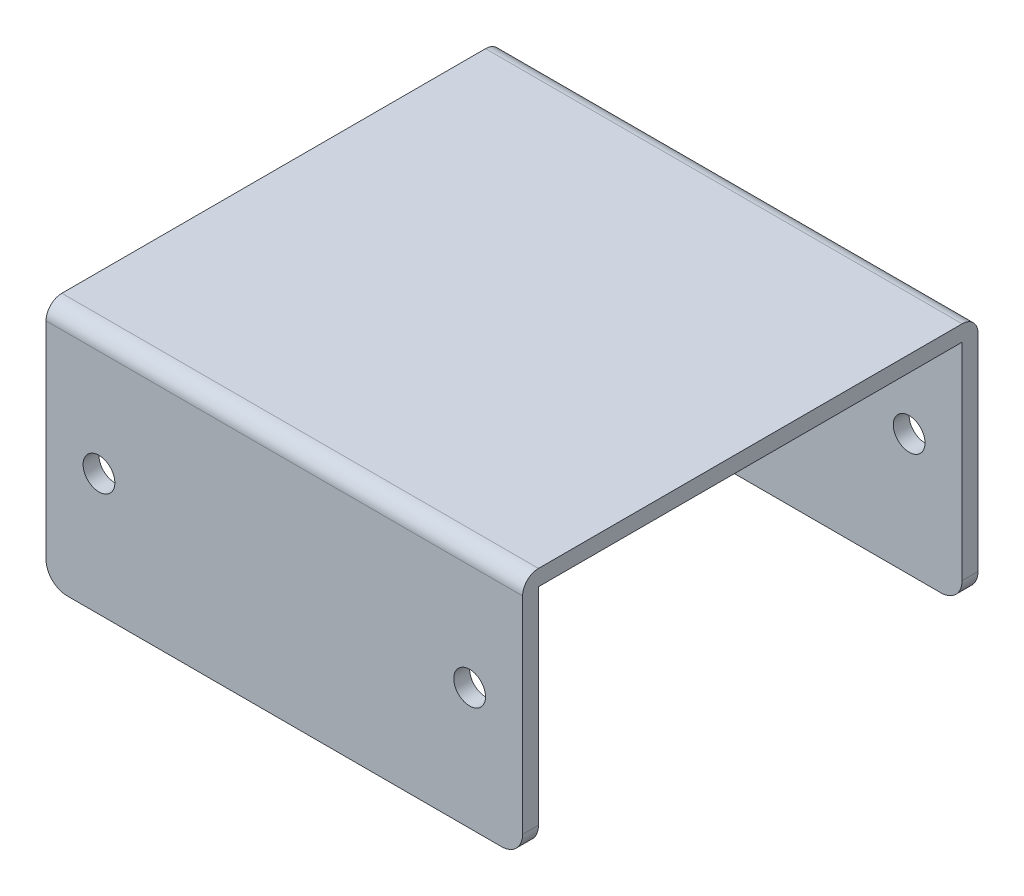
ISO-10303-21;
HEADER;
FILE_DESCRIPTION(('STEP AP214'),'2;1');
FILE_NAME('part.step','',(''),(''),'','','');
FILE_SCHEMA(('AUTOMOTIVE_DESIGN { 1 0 10303 214 1 1 1 1 }'));
ENDSEC;
DATA;
#1=APPLICATION_CONTEXT('core data for automotive mechanical design processes');
#2=APPLICATION_PROTOCOL_DEFINITION('international standard','automotive_design',2000,#1);
#3=PRODUCT_CONTEXT('',#1,'mechanical');
#4=PRODUCT('Part','Part','',(#3));
#5=PRODUCT_RELATED_PRODUCT_CATEGORY('part','',(#4));
#6=PRODUCT_DEFINITION_FORMATION('','',#4);
#7=PRODUCT_DEFINITION_CONTEXT('part definition',#1,'design');
#8=PRODUCT_DEFINITION('design','',#6,#7);
#9=PRODUCT_DEFINITION_SHAPE('','',#8);
#10=(LENGTH_UNIT() NAMED_UNIT(*) SI_UNIT(.MILLI.,.METRE.));
#11=(NAMED_UNIT(*) PLANE_ANGLE_UNIT() SI_UNIT($,.RADIAN.));
#12=(NAMED_UNIT(*) SI_UNIT($,.STERADIAN.) SOLID_ANGLE_UNIT());
#13=UNCERTAINTY_MEASURE_WITH_UNIT(LENGTH_MEASURE(1.E-05),#10,'distance_accuracy_value','');
#14=(GEOMETRIC_REPRESENTATION_CONTEXT(3) GLOBAL_UNCERTAINTY_ASSIGNED_CONTEXT((#13)) GLOBAL_UNIT_ASSIGNED_CONTEXT((#10,
#11,#12)) REPRESENTATION_CONTEXT('',''));
#15=CARTESIAN_POINT('',(0.,0.,0.));
#16=DIRECTION('',(0.,0.,1.));
#17=DIRECTION('',(1.,0.,0.));
#18=AXIS2_PLACEMENT_3D('',#15,#16,#17);
#19=CARTESIAN_POINT('',(0.,0.,0.));
#20=DIRECTION('',(0.,1.,0.));
#21=DIRECTION('',(0.,0.,1.));
#22=AXIS2_PLACEMENT_3D('',#19,#20,#21);
#23=PLANE('',#22);
#24=DIRECTION('',(-1.,0.,0.));
#25=VECTOR('',#24,1.);
#26=CARTESIAN_POINT('',(22.5,0.,-21.5));
#27=LINE('',#26,#25);
#28=CARTESIAN_POINT('',(20.5,0.,-21.5));
#29=VERTEX_POINT('',#28);
#30=CARTESIAN_POINT('',(-20.5,0.,-21.5));
#31=VERTEX_POINT('',#30);
#32=EDGE_CURVE('E187',#29,#31,#27,.T.);
#33=ORIENTED_EDGE('',*,*,#32,.F.);
#34=DIRECTION('',(0.,0.,-1.));
#35=VECTOR('',#34,1.);
#36=CARTESIAN_POINT('',(20.5,0.,0.));
#37=LINE('',#36,#35);
#38=CARTESIAN_POINT('',(20.5,0.,-20.));
#39=VERTEX_POINT('',#38);
#40=EDGE_CURVE('E243',#29,#39,#37,.F.);
#41=ORIENTED_EDGE('',*,*,#40,.T.);
#42=DIRECTION('',(-1.,0.,0.));
#43=VECTOR('',#42,1.);
#44=CARTESIAN_POINT('',(22.5,0.,-20.));
#45=LINE('',#44,#43);
#46=CARTESIAN_POINT('',(-20.5,0.,-20.));
#47=VERTEX_POINT('',#46);
#48=EDGE_CURVE('E169',#39,#47,#45,.T.);
#49=ORIENTED_EDGE('',*,*,#48,.T.);
#50=DIRECTION('',(0.,0.,1.));
#51=VECTOR('',#50,1.);
#52=CARTESIAN_POINT('',(-20.5,0.,0.));
#53=LINE('',#52,#51);
#54=EDGE_CURVE('E241',#47,#31,#53,.F.);
#55=ORIENTED_EDGE('',*,*,#54,.T.);
#56=EDGE_LOOP('',(#33,#41,#49,#55));
#57=FACE_BOUND('',#56,.T.);
#58=ADVANCED_FACE('F38',(#57),#23,.F.);
#59=CARTESIAN_POINT('',(-22.5,23.,21.5));
#60=DIRECTION('',(1.,0.,0.));
#61=DIRECTION('',(0.,0.,-1.));
#62=AXIS2_PLACEMENT_3D('',#59,#60,#61);
#63=PLANE('',#62);
#64=DIRECTION('',(0.,-1.,0.));
#65=VECTOR('',#64,1.);
#66=CARTESIAN_POINT('',(-22.5,23.,-21.5));
#67=LINE('',#66,#65);
#68=CARTESIAN_POINT('',(-22.5,21.5,-21.5));
#69=VERTEX_POINT('',#68);
#70=CARTESIAN_POINT('',(-22.5,2.,-21.5));
#71=VERTEX_POINT('',#70);
#72=EDGE_CURVE('E190',#69,#71,#67,.T.);
#73=ORIENTED_EDGE('',*,*,#72,.T.);
#74=DIRECTION('',(0.,0.,1.));
#75=VECTOR('',#74,1.);
#76=CARTESIAN_POINT('',(-22.5,2.,21.5));
#77=LINE('',#76,#75);
#78=CARTESIAN_POINT('',(-22.5,2.,-20.));
#79=VERTEX_POINT('',#78);
#80=EDGE_CURVE('E11',#71,#79,#77,.T.);
#81=ORIENTED_EDGE('',*,*,#80,.T.);
#82=DIRECTION('',(0.,-1.,0.));
#83=VECTOR('',#82,1.);
#84=CARTESIAN_POINT('',(-22.5,23.,-20.));
#85=LINE('',#84,#83);
#86=CARTESIAN_POINT('',(-22.5,21.5,-20.));
#87=VERTEX_POINT('',#86);
#88=EDGE_CURVE('E168',#87,#79,#85,.T.);
#89=ORIENTED_EDGE('',*,*,#88,.F.);
#90=DIRECTION('',(0.,0.,1.));
#91=VECTOR('',#90,1.);
#92=CARTESIAN_POINT('',(-22.5,21.5,21.5));
#93=LINE('',#92,#91);
#94=CARTESIAN_POINT('',(-22.5,21.5,20.));
#95=VERTEX_POINT('',#94);
#96=EDGE_CURVE('E147',#87,#95,#93,.T.);
#97=ORIENTED_EDGE('',*,*,#96,.T.);
#98=DIRECTION('',(0.,-1.,0.));
#99=VECTOR('',#98,1.);
#100=CARTESIAN_POINT('',(-22.5,23.,20.));
#101=LINE('',#100,#99);
#102=CARTESIAN_POINT('',(-22.5,2.,20.));
#103=VERTEX_POINT('',#102);
#104=EDGE_CURVE('E156',#95,#103,#101,.T.);
#105=ORIENTED_EDGE('',*,*,#104,.T.);
#106=DIRECTION('',(0.,0.,1.));
#107=VECTOR('',#106,1.);
#108=CARTESIAN_POINT('',(-22.5,2.,21.5));
#109=LINE('',#108,#107);
#110=CARTESIAN_POINT('',(-22.5,2.,21.5));
#111=VERTEX_POINT('',#110);
#112=EDGE_CURVE('E46',#103,#111,#109,.T.);
#113=ORIENTED_EDGE('',*,*,#112,.T.);
#114=DIRECTION('',(0.,-1.,0.));
#115=VECTOR('',#114,1.);
#116=CARTESIAN_POINT('',(-22.5,23.,21.5));
#117=LINE('',#116,#115);
#118=CARTESIAN_POINT('',(-22.5,21.5,21.5));
#119=VERTEX_POINT('',#118);
#120=EDGE_CURVE('E201',#119,#111,#117,.T.);
#121=ORIENTED_EDGE('',*,*,#120,.F.);
#122=CARTESIAN_POINT('',(-22.5,21.5,20.));
#123=DIRECTION('',(1.,0.,0.));
#124=DIRECTION('',(0.,0.,-1.));
#125=AXIS2_PLACEMENT_3D('',#122,#123,#124);
#126=CIRCLE('',#125,1.5);
#127=CARTESIAN_POINT('',(-22.5,23.,20.));
#128=VERTEX_POINT('',#127);
#129=EDGE_CURVE('E219',#119,#128,#126,.F.);
#130=ORIENTED_EDGE('',*,*,#129,.T.);
#131=DIRECTION('',(0.,0.,1.));
#132=VECTOR('',#131,1.);
#133=CARTESIAN_POINT('',(-22.5,23.,21.5));
#134=LINE('',#133,#132);
#135=CARTESIAN_POINT('',(-22.5,23.,-20.));
#136=VERTEX_POINT('',#135);
#137=EDGE_CURVE('E183',#136,#128,#134,.T.);
#138=ORIENTED_EDGE('',*,*,#137,.F.);
#139=CARTESIAN_POINT('',(-22.5,21.5,-20.));
#140=DIRECTION('',(1.,0.,0.));
#141=DIRECTION('',(0.,0.,-1.));
#142=AXIS2_PLACEMENT_3D('',#139,#140,#141);
#143=CIRCLE('',#142,1.5);
#144=EDGE_CURVE('E221',#136,#69,#143,.F.);
#145=ORIENTED_EDGE('',*,*,#144,.T.);
#146=EDGE_LOOP('',(#73,#81,#89,#97,#105,#113,#121,#130,#138,#145));
#147=FACE_BOUND('',#146,.T.);
#148=ADVANCED_FACE('F166',(#147),#63,.F.);
#149=CARTESIAN_POINT('',(22.5,23.,21.5));
#150=DIRECTION('',(0.,0.,-1.));
#151=DIRECTION('',(-1.,0.,0.));
#152=AXIS2_PLACEMENT_3D('',#149,#150,#151);
#153=PLANE('',#152);
#154=CARTESIAN_POINT('',(-17.5,11.5,21.5));
#155=DIRECTION('',(0.,0.,1.));
#156=DIRECTION('',(1.,0.,0.));
#157=AXIS2_PLACEMENT_3D('',#154,#155,#156);
#158=CIRCLE('',#157,1.5);
#159=CARTESIAN_POINT('',(-16.,11.5,21.5));
#160=VERTEX_POINT('',#159);
#161=EDGE_CURVE('E302',#160,#160,#158,.T.);
#162=ORIENTED_EDGE('',*,*,#161,.F.);
#163=EDGE_LOOP('',(#162));
#164=FACE_BOUND('',#163,.T.);
#165=CARTESIAN_POINT('',(17.5,11.5,21.5));
#166=DIRECTION('',(0.,0.,1.));
#167=DIRECTION('',(1.,0.,0.));
#168=AXIS2_PLACEMENT_3D('',#165,#166,#167);
#169=CIRCLE('',#168,1.5);
#170=CARTESIAN_POINT('',(19.,11.5,21.5));
#171=VERTEX_POINT('',#170);
#172=EDGE_CURVE('E296',#171,#171,#169,.T.);
#173=ORIENTED_EDGE('',*,*,#172,.F.);
#174=EDGE_LOOP('',(#173));
#175=FACE_BOUND('',#174,.T.);
#176=DIRECTION('',(1.,0.,0.));
#177=VECTOR('',#176,1.);
#178=CARTESIAN_POINT('',(22.5,0.,21.5));
#179=LINE('',#178,#177);
#180=CARTESIAN_POINT('',(-20.5,0.,21.5));
#181=VERTEX_POINT('',#180);
#182=CARTESIAN_POINT('',(20.5,0.,21.5));
#183=VERTEX_POINT('',#182);
#184=EDGE_CURVE('E162',#181,#183,#179,.T.);
#185=ORIENTED_EDGE('',*,*,#184,.T.);
#186=CARTESIAN_POINT('',(20.5,2.,21.5));
#187=DIRECTION('',(0.,0.,-1.));
#188=DIRECTION('',(-1.,0.,0.));
#189=AXIS2_PLACEMENT_3D('',#186,#187,#188);
#190=CIRCLE('',#189,2.);
#191=CARTESIAN_POINT('',(22.5,2.,21.5));
#192=VERTEX_POINT('',#191);
#193=EDGE_CURVE('E256',#183,#192,#190,.F.);
#194=ORIENTED_EDGE('',*,*,#193,.T.);
#195=DIRECTION('',(0.,-1.,0.));
#196=VECTOR('',#195,1.);
#197=CARTESIAN_POINT('',(22.5,23.,21.5));
#198=LINE('',#197,#196);
#199=CARTESIAN_POINT('',(22.5,21.5,21.5));
#200=VERTEX_POINT('',#199);
#201=EDGE_CURVE('E198',#200,#192,#198,.T.);
#202=ORIENTED_EDGE('',*,*,#201,.F.);
#203=DIRECTION('',(1.,0.,0.));
#204=VECTOR('',#203,1.);
#205=CARTESIAN_POINT('',(-22.5,21.5,21.5));
#206=LINE('',#205,#204);
#207=EDGE_CURVE('E229',#200,#119,#206,.F.);
#208=ORIENTED_EDGE('',*,*,#207,.T.);
#209=ORIENTED_EDGE('',*,*,#120,.T.);
#210=CARTESIAN_POINT('',(-20.5,2.,21.5));
#211=DIRECTION('',(0.,0.,-1.));
#212=DIRECTION('',(-1.,0.,0.));
#213=AXIS2_PLACEMENT_3D('',#210,#211,#212);
#214=CIRCLE('',#213,2.);
#215=EDGE_CURVE('E53',#111,#181,#214,.F.);
#216=ORIENTED_EDGE('',*,*,#215,.T.);
#217=EDGE_LOOP('',(#185,#194,#202,#208,#209,#216));
#218=FACE_BOUND('',#217,.T.);
#219=ADVANCED_FACE('F260',(#164,#175,#218),#153,.F.);
#220=CARTESIAN_POINT('',(22.5,23.,21.5));
#221=DIRECTION('',(-1.,0.,0.));
#222=DIRECTION('',(0.,0.,1.));
#223=AXIS2_PLACEMENT_3D('',#220,#221,#222);
#224=PLANE('',#223);
#225=DIRECTION('',(0.,-1.,0.));
#226=VECTOR('',#225,1.);
#227=CARTESIAN_POINT('',(22.5,23.,-20.));
#228=LINE('',#227,#226);
#229=CARTESIAN_POINT('',(22.5,21.5,-20.));
#230=VERTEX_POINT('',#229);
#231=CARTESIAN_POINT('',(22.5,2.,-20.));
#232=VERTEX_POINT('',#231);
#233=EDGE_CURVE('E176',#230,#232,#228,.T.);
#234=ORIENTED_EDGE('',*,*,#233,.T.);
#235=DIRECTION('',(0.,0.,-1.));
#236=VECTOR('',#235,1.);
#237=CARTESIAN_POINT('',(22.5,2.,21.5));
#238=LINE('',#237,#236);
#239=CARTESIAN_POINT('',(22.5,2.,-21.5));
#240=VERTEX_POINT('',#239);
#241=EDGE_CURVE('E234',#232,#240,#238,.T.);
#242=ORIENTED_EDGE('',*,*,#241,.T.);
#243=DIRECTION('',(0.,-1.,0.));
#244=VECTOR('',#243,1.);
#245=CARTESIAN_POINT('',(22.5,23.,-21.5));
#246=LINE('',#245,#244);
#247=CARTESIAN_POINT('',(22.5,21.5,-21.5));
#248=VERTEX_POINT('',#247);
#249=EDGE_CURVE('E195',#248,#240,#246,.T.);
#250=ORIENTED_EDGE('',*,*,#249,.F.);
#251=CARTESIAN_POINT('',(22.5,21.5,-20.));
#252=DIRECTION('',(-1.,0.,0.));
#253=DIRECTION('',(0.,0.,1.));
#254=AXIS2_PLACEMENT_3D('',#251,#252,#253);
#255=CIRCLE('',#254,1.5);
#256=CARTESIAN_POINT('',(22.5,23.,-20.));
#257=VERTEX_POINT('',#256);
#258=EDGE_CURVE('E227',#248,#257,#255,.F.);
#259=ORIENTED_EDGE('',*,*,#258,.T.);
#260=DIRECTION('',(0.,0.,-1.));
#261=VECTOR('',#260,1.);
#262=CARTESIAN_POINT('',(22.5,23.,21.5));
#263=LINE('',#262,#261);
#264=CARTESIAN_POINT('',(22.5,23.,20.));
#265=VERTEX_POINT('',#264);
#266=EDGE_CURVE('E186',#265,#257,#263,.T.);
#267=ORIENTED_EDGE('',*,*,#266,.F.);
#268=CARTESIAN_POINT('',(22.5,21.5,20.));
#269=DIRECTION('',(-1.,0.,0.));
#270=DIRECTION('',(0.,0.,1.));
#271=AXIS2_PLACEMENT_3D('',#268,#269,#270);
#272=CIRCLE('',#271,1.5);
#273=EDGE_CURVE('E225',#265,#200,#272,.F.);
#274=ORIENTED_EDGE('',*,*,#273,.T.);
#275=ORIENTED_EDGE('',*,*,#201,.T.);
#276=DIRECTION('',(0.,0.,-1.));
#277=VECTOR('',#276,1.);
#278=CARTESIAN_POINT('',(22.5,2.,21.5));
#279=LINE('',#278,#277);
#280=CARTESIAN_POINT('',(22.5,2.,20.));
#281=VERTEX_POINT('',#280);
#282=EDGE_CURVE('E231',#192,#281,#279,.T.);
#283=ORIENTED_EDGE('',*,*,#282,.T.);
#284=DIRECTION('',(0.,-1.,0.));
#285=VECTOR('',#284,1.);
#286=CARTESIAN_POINT('',(22.5,23.,20.));
#287=LINE('',#286,#285);
#288=CARTESIAN_POINT('',(22.5,21.5,20.));
#289=VERTEX_POINT('',#288);
#290=EDGE_CURVE('E163',#289,#281,#287,.T.);
#291=ORIENTED_EDGE('',*,*,#290,.F.);
#292=DIRECTION('',(0.,0.,-1.));
#293=VECTOR('',#292,1.);
#294=CARTESIAN_POINT('',(22.5,21.5,21.5));
#295=LINE('',#294,#293);
#296=EDGE_CURVE('E150',#289,#230,#295,.T.);
#297=ORIENTED_EDGE('',*,*,#296,.T.);
#298=EDGE_LOOP('',(#234,#242,#250,#259,#267,#274,#275,#283,#291,#297));
#299=FACE_BOUND('',#298,.T.);
#300=ADVANCED_FACE('F348',(#299),#224,.F.);
#301=CARTESIAN_POINT('',(22.5,23.,-21.5));
#302=DIRECTION('',(0.,0.,1.));
#303=DIRECTION('',(1.,0.,0.));
#304=AXIS2_PLACEMENT_3D('',#301,#302,#303);
#305=PLANE('',#304);
#306=CARTESIAN_POINT('',(-17.5,11.5,-21.5));
#307=DIRECTION('',(0.,0.,1.));
#308=DIRECTION('',(1.,0.,0.));
#309=AXIS2_PLACEMENT_3D('',#306,#307,#308);
#310=CIRCLE('',#309,1.5);
#311=CARTESIAN_POINT('',(-16.,11.5,-21.5));
#312=VERTEX_POINT('',#311);
#313=EDGE_CURVE('E209',#312,#312,#310,.T.);
#314=ORIENTED_EDGE('',*,*,#313,.T.);
#315=EDGE_LOOP('',(#314));
#316=FACE_BOUND('',#315,.T.);
#317=CARTESIAN_POINT('',(17.5,11.5,-21.5));
#318=DIRECTION('',(0.,0.,1.));
#319=DIRECTION('',(1.,0.,0.));
#320=AXIS2_PLACEMENT_3D('',#317,#318,#319);
#321=CIRCLE('',#320,1.5);
#322=CARTESIAN_POINT('',(19.,11.5,-21.5));
#323=VERTEX_POINT('',#322);
#324=EDGE_CURVE('E299',#323,#323,#321,.T.);
#325=ORIENTED_EDGE('',*,*,#324,.T.);
#326=EDGE_LOOP('',(#325));
#327=FACE_BOUND('',#326,.T.);
#328=ORIENTED_EDGE('',*,*,#249,.T.);
#329=CARTESIAN_POINT('',(20.5,2.,-21.5));
#330=DIRECTION('',(0.,0.,1.));
#331=DIRECTION('',(1.,0.,0.));
#332=AXIS2_PLACEMENT_3D('',#329,#330,#331);
#333=CIRCLE('',#332,2.);
#334=EDGE_CURVE('E239',#240,#29,#333,.F.);
#335=ORIENTED_EDGE('',*,*,#334,.T.);
#336=ORIENTED_EDGE('',*,*,#32,.T.);
#337=CARTESIAN_POINT('',(-20.5,2.,-21.5));
#338=DIRECTION('',(0.,0.,1.));
#339=DIRECTION('',(1.,0.,0.));
#340=AXIS2_PLACEMENT_3D('',#337,#338,#339);
#341=CIRCLE('',#340,2.);
#342=EDGE_CURVE('E237',#31,#71,#341,.F.);
#343=ORIENTED_EDGE('',*,*,#342,.T.);
#344=ORIENTED_EDGE('',*,*,#72,.F.);
#345=DIRECTION('',(-1.,0.,0.));
#346=VECTOR('',#345,1.);
#347=CARTESIAN_POINT('',(22.5,21.5,-21.5));
#348=LINE('',#347,#346);
#349=EDGE_CURVE('E223',#69,#248,#348,.F.);
#350=ORIENTED_EDGE('',*,*,#349,.T.);
#351=EDGE_LOOP('',(#328,#335,#336,#343,#344,#350));
#352=FACE_BOUND('',#351,.T.);
#353=ADVANCED_FACE('F278',(#316,#327,#352),#305,.F.);
#354=CARTESIAN_POINT('',(0.,23.,0.));
#355=DIRECTION('',(0.,1.,0.));
#356=DIRECTION('',(0.,0.,1.));
#357=AXIS2_PLACEMENT_3D('',#354,#355,#356);
#358=PLANE('',#357);
#359=ORIENTED_EDGE('',*,*,#266,.T.);
#360=DIRECTION('',(-1.,0.,0.));
#361=VECTOR('',#360,1.);
#362=CARTESIAN_POINT('',(-22.5,23.,-20.));
#363=LINE('',#362,#361);
#364=EDGE_CURVE('E216',#257,#136,#363,.T.);
#365=ORIENTED_EDGE('',*,*,#364,.T.);
#366=ORIENTED_EDGE('',*,*,#137,.T.);
#367=DIRECTION('',(1.,0.,0.));
#368=VECTOR('',#367,1.);
#369=CARTESIAN_POINT('',(22.5,23.,20.));
#370=LINE('',#369,#368);
#371=EDGE_CURVE('E204',#128,#265,#370,.T.);
#372=ORIENTED_EDGE('',*,*,#371,.T.);
#373=EDGE_LOOP('',(#359,#365,#366,#372));
#374=FACE_BOUND('',#373,.T.);
#375=ADVANCED_FACE('F268',(#374),#358,.T.);
#376=DIRECTION('',(1.,0.,0.));
#377=VECTOR('',#376,1.);
#378=CARTESIAN_POINT('',(22.5,0.,20.));
#379=LINE('',#378,#377);
#380=CARTESIAN_POINT('',(-20.5,0.,20.));
#381=VERTEX_POINT('',#380);
#382=CARTESIAN_POINT('',(20.5,0.,20.));
#383=VERTEX_POINT('',#382);
#384=EDGE_CURVE('E172',#381,#383,#379,.T.);
#385=ORIENTED_EDGE('',*,*,#384,.T.);
#386=DIRECTION('',(0.,0.,-1.));
#387=VECTOR('',#386,1.);
#388=CARTESIAN_POINT('',(20.5,0.,0.));
#389=LINE('',#388,#387);
#390=EDGE_CURVE('E61',#383,#183,#389,.F.);
#391=ORIENTED_EDGE('',*,*,#390,.T.);
#392=ORIENTED_EDGE('',*,*,#184,.F.);
#393=DIRECTION('',(0.,0.,1.));
#394=VECTOR('',#393,1.);
#395=CARTESIAN_POINT('',(-20.5,0.,0.));
#396=LINE('',#395,#394);
#397=EDGE_CURVE('E252',#181,#381,#396,.F.);
#398=ORIENTED_EDGE('',*,*,#397,.T.);
#399=EDGE_LOOP('',(#385,#391,#392,#398));
#400=FACE_BOUND('',#399,.T.);
#401=ADVANCED_FACE('F328',(#400),#23,.F.);
#402=CARTESIAN_POINT('',(22.5,23.,20.));
#403=DIRECTION('',(0.,0.,-1.));
#404=DIRECTION('',(-1.,0.,0.));
#405=AXIS2_PLACEMENT_3D('',#402,#403,#404);
#406=PLANE('',#405);
#407=CARTESIAN_POINT('',(-17.5,11.5,20.));
#408=DIRECTION('',(0.,0.,-1.));
#409=DIRECTION('',(-1.,0.,0.));
#410=AXIS2_PLACEMENT_3D('',#407,#408,#409);
#411=CIRCLE('',#410,1.5);
#412=CARTESIAN_POINT('',(-19.,11.5,20.));
#413=VERTEX_POINT('',#412);
#414=EDGE_CURVE('E213',#413,#413,#411,.T.);
#415=ORIENTED_EDGE('',*,*,#414,.F.);
#416=EDGE_LOOP('',(#415));
#417=FACE_BOUND('',#416,.T.);
#418=CARTESIAN_POINT('',(17.5,11.5,20.));
#419=DIRECTION('',(0.,0.,-1.));
#420=DIRECTION('',(-1.,0.,0.));
#421=AXIS2_PLACEMENT_3D('',#418,#419,#420);
#422=CIRCLE('',#421,1.5);
#423=CARTESIAN_POINT('',(16.,11.5,20.));
#424=VERTEX_POINT('',#423);
#425=EDGE_CURVE('E208',#424,#424,#422,.T.);
#426=ORIENTED_EDGE('',*,*,#425,.F.);
#427=EDGE_LOOP('',(#426));
#428=FACE_BOUND('',#427,.T.);
#429=ORIENTED_EDGE('',*,*,#290,.T.);
#430=CARTESIAN_POINT('',(20.5,2.,20.));
#431=DIRECTION('',(0.,0.,-1.));
#432=DIRECTION('',(-1.,0.,0.));
#433=AXIS2_PLACEMENT_3D('',#430,#431,#432);
#434=CIRCLE('',#433,2.);
#435=EDGE_CURVE('E250',#281,#383,#434,.T.);
#436=ORIENTED_EDGE('',*,*,#435,.T.);
#437=ORIENTED_EDGE('',*,*,#384,.F.);
#438=CARTESIAN_POINT('',(-20.5,2.,20.));
#439=DIRECTION('',(0.,0.,-1.));
#440=DIRECTION('',(-1.,0.,0.));
#441=AXIS2_PLACEMENT_3D('',#438,#439,#440);
#442=CIRCLE('',#441,2.);
#443=EDGE_CURVE('E160',#381,#103,#442,.T.);
#444=ORIENTED_EDGE('',*,*,#443,.T.);
#445=ORIENTED_EDGE('',*,*,#104,.F.);
#446=DIRECTION('',(1.,0.,0.));
#447=VECTOR('',#446,1.);
#448=CARTESIAN_POINT('',(22.5,21.5,20.));
#449=LINE('',#448,#447);
#450=EDGE_CURVE('E142',#95,#289,#449,.T.);
#451=ORIENTED_EDGE('',*,*,#450,.T.);
#452=EDGE_LOOP('',(#429,#436,#437,#444,#445,#451));
#453=FACE_BOUND('',#452,.T.);
#454=ADVANCED_FACE('F157',(#417,#428,#453),#406,.T.);
#455=CARTESIAN_POINT('',(22.5,23.,-20.));
#456=DIRECTION('',(0.,0.,1.));
#457=DIRECTION('',(1.,0.,0.));
#458=AXIS2_PLACEMENT_3D('',#455,#456,#457);
#459=PLANE('',#458);
#460=CARTESIAN_POINT('',(-17.5,11.5,-20.));
#461=DIRECTION('',(0.,0.,1.));
#462=DIRECTION('',(1.,0.,0.));
#463=AXIS2_PLACEMENT_3D('',#460,#461,#462);
#464=CIRCLE('',#463,1.5);
#465=CARTESIAN_POINT('',(-16.,11.5,-20.));
#466=VERTEX_POINT('',#465);
#467=EDGE_CURVE('E210',#466,#466,#464,.T.);
#468=ORIENTED_EDGE('',*,*,#467,.F.);
#469=EDGE_LOOP('',(#468));
#470=FACE_BOUND('',#469,.T.);
#471=CARTESIAN_POINT('',(17.5,11.5,-20.));
#472=DIRECTION('',(0.,0.,1.));
#473=DIRECTION('',(1.,0.,0.));
#474=AXIS2_PLACEMENT_3D('',#471,#472,#473);
#475=CIRCLE('',#474,1.5);
#476=CARTESIAN_POINT('',(19.,11.5,-20.));
#477=VERTEX_POINT('',#476);
#478=EDGE_CURVE('E205',#477,#477,#475,.T.);
#479=ORIENTED_EDGE('',*,*,#478,.F.);
#480=EDGE_LOOP('',(#479));
#481=FACE_BOUND('',#480,.T.);
#482=ORIENTED_EDGE('',*,*,#48,.F.);
#483=CARTESIAN_POINT('',(20.5,2.,-20.));
#484=DIRECTION('',(0.,0.,1.));
#485=DIRECTION('',(1.,0.,0.));
#486=AXIS2_PLACEMENT_3D('',#483,#484,#485);
#487=CIRCLE('',#486,2.);
#488=EDGE_CURVE('E247',#39,#232,#487,.T.);
#489=ORIENTED_EDGE('',*,*,#488,.T.);
#490=ORIENTED_EDGE('',*,*,#233,.F.);
#491=DIRECTION('',(-1.,0.,0.));
#492=VECTOR('',#491,1.);
#493=CARTESIAN_POINT('',(22.5,21.5,-20.));
#494=LINE('',#493,#492);
#495=EDGE_CURVE('E177',#230,#87,#494,.T.);
#496=ORIENTED_EDGE('',*,*,#495,.T.);
#497=ORIENTED_EDGE('',*,*,#88,.T.);
#498=CARTESIAN_POINT('',(-20.5,2.,-20.));
#499=DIRECTION('',(0.,0.,1.));
#500=DIRECTION('',(1.,0.,0.));
#501=AXIS2_PLACEMENT_3D('',#498,#499,#500);
#502=CIRCLE('',#501,2.);
#503=EDGE_CURVE('E245',#79,#47,#502,.T.);
#504=ORIENTED_EDGE('',*,*,#503,.T.);
#505=EDGE_LOOP('',(#482,#489,#490,#496,#497,#504));
#506=FACE_BOUND('',#505,.T.);
#507=ADVANCED_FACE('F287',(#470,#481,#506),#459,.T.);
#508=CARTESIAN_POINT('',(0.,21.5,0.));
#509=DIRECTION('',(0.,1.,0.));
#510=DIRECTION('',(0.,0.,1.));
#511=AXIS2_PLACEMENT_3D('',#508,#509,#510);
#512=PLANE('',#511);
#513=ORIENTED_EDGE('',*,*,#96,.F.);
#514=ORIENTED_EDGE('',*,*,#495,.F.);
#515=ORIENTED_EDGE('',*,*,#296,.F.);
#516=ORIENTED_EDGE('',*,*,#450,.F.);
#517=EDGE_LOOP('',(#513,#514,#515,#516));
#518=FACE_BOUND('',#517,.T.);
#519=ADVANCED_FACE('F144',(#518),#512,.F.);
#520=CARTESIAN_POINT('',(17.5,11.5,-21.5));
#521=DIRECTION('',(0.,0.,1.));
#522=DIRECTION('',(1.,0.,0.));
#523=AXIS2_PLACEMENT_3D('',#520,#521,#522);
#524=CYLINDRICAL_SURFACE('',#523,1.5);
#525=ORIENTED_EDGE('',*,*,#478,.T.);
#526=EDGE_LOOP('',(#525));
#527=FACE_BOUND('',#526,.T.);
#528=ORIENTED_EDGE('',*,*,#324,.F.);
#529=EDGE_LOOP('',(#528));
#530=FACE_BOUND('',#529,.T.);
#531=ADVANCED_FACE('F313',(#527,#530),#524,.F.);
#532=CARTESIAN_POINT('',(-17.5,11.5,-21.5));
#533=DIRECTION('',(0.,0.,1.));
#534=DIRECTION('',(1.,0.,0.));
#535=AXIS2_PLACEMENT_3D('',#532,#533,#534);
#536=CYLINDRICAL_SURFACE('',#535,1.5);
#537=ORIENTED_EDGE('',*,*,#467,.T.);
#538=EDGE_LOOP('',(#537));
#539=FACE_BOUND('',#538,.T.);
#540=ORIENTED_EDGE('',*,*,#313,.F.);
#541=EDGE_LOOP('',(#540));
#542=FACE_BOUND('',#541,.T.);
#543=ADVANCED_FACE('F310',(#539,#542),#536,.F.);
#544=ORIENTED_EDGE('',*,*,#425,.T.);
#545=EDGE_LOOP('',(#544));
#546=FACE_BOUND('',#545,.T.);
#547=ORIENTED_EDGE('',*,*,#172,.T.);
#548=EDGE_LOOP('',(#547));
#549=FACE_BOUND('',#548,.T.);
#550=ADVANCED_FACE('F312',(#546,#549),#524,.F.);
#551=ORIENTED_EDGE('',*,*,#414,.T.);
#552=EDGE_LOOP('',(#551));
#553=FACE_BOUND('',#552,.T.);
#554=ORIENTED_EDGE('',*,*,#161,.T.);
#555=EDGE_LOOP('',(#554));
#556=FACE_BOUND('',#555,.T.);
#557=ADVANCED_FACE('F316',(#553,#556),#536,.F.);
#558=CARTESIAN_POINT('',(0.,21.5,-20.));
#559=DIRECTION('',(1.,0.,0.));
#560=DIRECTION('',(0.,0.,-1.));
#561=AXIS2_PLACEMENT_3D('',#558,#559,#560);
#562=CYLINDRICAL_SURFACE('',#561,1.5);
#563=ORIENTED_EDGE('',*,*,#258,.F.);
#564=ORIENTED_EDGE('',*,*,#349,.F.);
#565=ORIENTED_EDGE('',*,*,#144,.F.);
#566=ORIENTED_EDGE('',*,*,#364,.F.);
#567=EDGE_LOOP('',(#563,#564,#565,#566));
#568=FACE_BOUND('',#567,.T.);
#569=ADVANCED_FACE('F273',(#568),#562,.T.);
#570=CARTESIAN_POINT('',(0.,21.5,20.));
#571=DIRECTION('',(-1.,0.,0.));
#572=DIRECTION('',(0.,0.,1.));
#573=AXIS2_PLACEMENT_3D('',#570,#571,#572);
#574=CYLINDRICAL_SURFACE('',#573,1.5);
#575=ORIENTED_EDGE('',*,*,#129,.F.);
#576=ORIENTED_EDGE('',*,*,#207,.F.);
#577=ORIENTED_EDGE('',*,*,#273,.F.);
#578=ORIENTED_EDGE('',*,*,#371,.F.);
#579=EDGE_LOOP('',(#575,#576,#577,#578));
#580=FACE_BOUND('',#579,.T.);
#581=ADVANCED_FACE('F264',(#580),#574,.T.);
#582=CARTESIAN_POINT('',(20.5,2.,21.5));
#583=DIRECTION('',(0.,0.,-1.));
#584=DIRECTION('',(-1.,0.,0.));
#585=AXIS2_PLACEMENT_3D('',#582,#583,#584);
#586=CYLINDRICAL_SURFACE('',#585,2.);
#587=ORIENTED_EDGE('',*,*,#488,.F.);
#588=ORIENTED_EDGE('',*,*,#40,.F.);
#589=ORIENTED_EDGE('',*,*,#334,.F.);
#590=ORIENTED_EDGE('',*,*,#241,.F.);
#591=EDGE_LOOP('',(#587,#588,#589,#590));
#592=FACE_BOUND('',#591,.T.);
#593=ADVANCED_FACE('F366',(#592),#586,.T.);
#594=CARTESIAN_POINT('',(20.5,2.,21.5));
#595=DIRECTION('',(0.,0.,-1.));
#596=DIRECTION('',(-1.,0.,0.));
#597=AXIS2_PLACEMENT_3D('',#594,#595,#596);
#598=CYLINDRICAL_SURFACE('',#597,2.);
#599=ORIENTED_EDGE('',*,*,#193,.F.);
#600=ORIENTED_EDGE('',*,*,#390,.F.);
#601=ORIENTED_EDGE('',*,*,#435,.F.);
#602=ORIENTED_EDGE('',*,*,#282,.F.);
#603=EDGE_LOOP('',(#599,#600,#601,#602));
#604=FACE_BOUND('',#603,.T.);
#605=ADVANCED_FACE('F371',(#604),#598,.T.);
#606=CARTESIAN_POINT('',(-20.5,2.,21.5));
#607=DIRECTION('',(0.,0.,1.));
#608=DIRECTION('',(1.,0.,0.));
#609=AXIS2_PLACEMENT_3D('',#606,#607,#608);
#610=CYLINDRICAL_SURFACE('',#609,2.);
#611=ORIENTED_EDGE('',*,*,#342,.F.);
#612=ORIENTED_EDGE('',*,*,#54,.F.);
#613=ORIENTED_EDGE('',*,*,#503,.F.);
#614=ORIENTED_EDGE('',*,*,#80,.F.);
#615=EDGE_LOOP('',(#611,#612,#613,#614));
#616=FACE_BOUND('',#615,.T.);
#617=ADVANCED_FACE('F284',(#616),#610,.T.);
#618=CARTESIAN_POINT('',(-20.5,2.,21.5));
#619=DIRECTION('',(0.,0.,1.));
#620=DIRECTION('',(1.,0.,0.));
#621=AXIS2_PLACEMENT_3D('',#618,#619,#620);
#622=CYLINDRICAL_SURFACE('',#621,2.);
#623=ORIENTED_EDGE('',*,*,#443,.F.);
#624=ORIENTED_EDGE('',*,*,#397,.F.);
#625=ORIENTED_EDGE('',*,*,#215,.F.);
#626=ORIENTED_EDGE('',*,*,#112,.F.);
#627=EDGE_LOOP('',(#623,#624,#625,#626));
#628=FACE_BOUND('',#627,.T.);
#629=ADVANCED_FACE('F40',(#628),#622,.T.);
#630=CLOSED_SHELL('',(#58,#148,#219,#300,#353,#375,#401,#454,#507,#519,#531,#543,#550,#557,#569,
#581,#593,#605,#617,#629));
#631=MANIFOLD_SOLID_BREP('B2',#630);
#632=ADVANCED_BREP_SHAPE_REPRESENTATION('',(#18,#631),#14);
#633=SHAPE_DEFINITION_REPRESENTATION(#9,#632);
ENDSEC;
END-ISO-10303-21;
